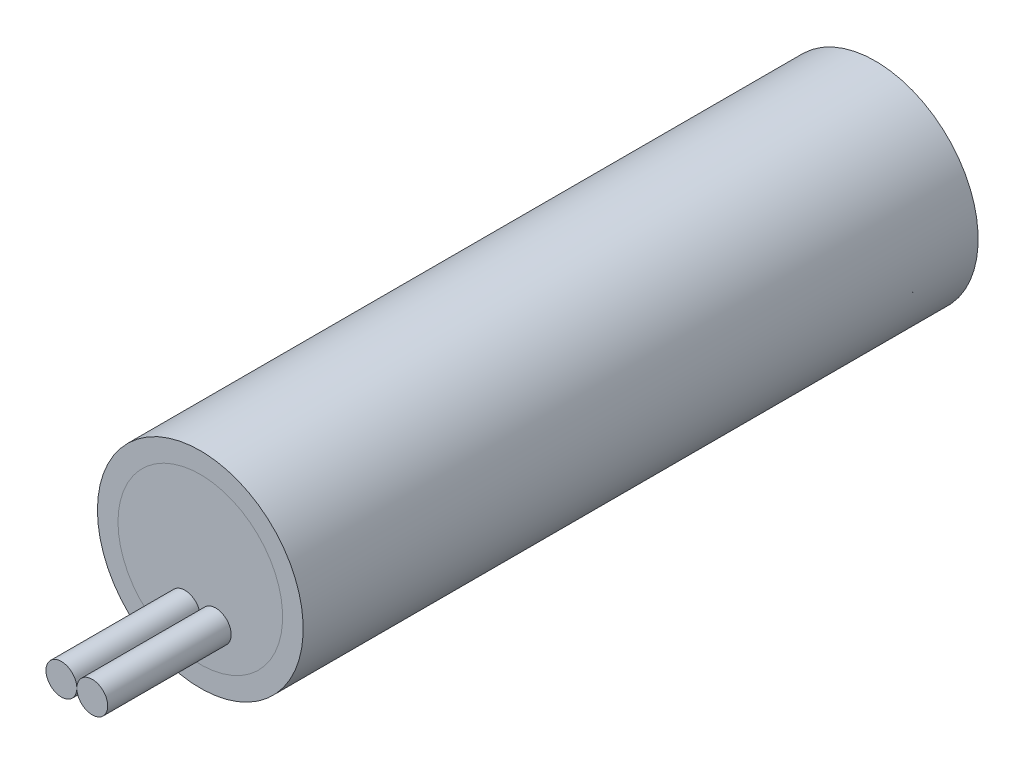
ISO-10303-21;
HEADER;
FILE_DESCRIPTION(('STEP AP214'),'2;1');
FILE_NAME('part.step','',(''),(''),'','','');
FILE_SCHEMA(('AUTOMOTIVE_DESIGN { 1 0 10303 214 1 1 1 1 }'));
ENDSEC;
DATA;
#1=APPLICATION_CONTEXT('core data for automotive mechanical design processes');
#2=APPLICATION_PROTOCOL_DEFINITION('international standard','automotive_design',2000,#1);
#3=PRODUCT_CONTEXT('',#1,'mechanical');
#4=PRODUCT('Part','Part','',(#3));
#5=PRODUCT_RELATED_PRODUCT_CATEGORY('part','',(#4));
#6=PRODUCT_DEFINITION_FORMATION('','',#4);
#7=PRODUCT_DEFINITION_CONTEXT('part definition',#1,'design');
#8=PRODUCT_DEFINITION('design','',#6,#7);
#9=PRODUCT_DEFINITION_SHAPE('','',#8);
#10=(LENGTH_UNIT() NAMED_UNIT(*) SI_UNIT(.MILLI.,.METRE.));
#11=(NAMED_UNIT(*) PLANE_ANGLE_UNIT() SI_UNIT($,.RADIAN.));
#12=(NAMED_UNIT(*) SI_UNIT($,.STERADIAN.) SOLID_ANGLE_UNIT());
#13=UNCERTAINTY_MEASURE_WITH_UNIT(LENGTH_MEASURE(1.E-05),#10,'distance_accuracy_value','');
#14=(GEOMETRIC_REPRESENTATION_CONTEXT(3) GLOBAL_UNCERTAINTY_ASSIGNED_CONTEXT((#13)) GLOBAL_UNIT_ASSIGNED_CONTEXT((#10,
#11,#12)) REPRESENTATION_CONTEXT('',''));
#15=CARTESIAN_POINT('',(0.,0.,0.));
#16=DIRECTION('',(0.,0.,1.));
#17=DIRECTION('',(1.,0.,0.));
#18=AXIS2_PLACEMENT_3D('',#15,#16,#17);
#19=CARTESIAN_POINT('',(0.,0.,0.));
#20=DIRECTION('',(0.,0.,1.));
#21=DIRECTION('',(1.,0.,0.));
#22=AXIS2_PLACEMENT_3D('',#19,#20,#21);
#23=PLANE('',#22);
#24=CARTESIAN_POINT('',(0.,0.,0.));
#25=DIRECTION('',(0.,0.,-1.));
#26=DIRECTION('',(1.,0.,0.));
#27=AXIS2_PLACEMENT_3D('',#24,#25,#26);
#28=CIRCLE('',#27,4.);
#29=CARTESIAN_POINT('',(-4.,0.,0.));
#30=VERTEX_POINT('',#29);
#31=EDGE_CURVE('P0_E48',#30,#30,#28,.T.);
#32=ORIENTED_EDGE('',*,*,#31,.F.);
#33=EDGE_LOOP('',(#32));
#34=FACE_BOUND('',#33,.T.);
#35=CARTESIAN_POINT('',(0.,0.,0.));
#36=DIRECTION('',(0.,0.,1.));
#37=DIRECTION('',(1.,0.,0.));
#38=AXIS2_PLACEMENT_3D('',#35,#36,#37);
#39=CIRCLE('',#38,5.);
#40=CARTESIAN_POINT('',(-5.,0.,0.));
#41=VERTEX_POINT('',#40);
#42=EDGE_CURVE('P0_E10',#41,#41,#39,.T.);
#43=ORIENTED_EDGE('',*,*,#42,.F.);
#44=EDGE_LOOP('',(#43));
#45=FACE_BOUND('',#44,.T.);
#46=ADVANCED_FACE('P0_F16',(#34,#45),#23,.F.);
#47=CARTESIAN_POINT('',(0.,0.,32.8));
#48=DIRECTION('',(0.,0.,1.));
#49=DIRECTION('',(1.,0.,0.));
#50=AXIS2_PLACEMENT_3D('',#47,#48,#49);
#51=PLANE('',#50);
#52=CARTESIAN_POINT('',(0.,0.,32.8));
#53=DIRECTION('',(0.,0.,-1.));
#54=DIRECTION('',(1.,0.,0.));
#55=AXIS2_PLACEMENT_3D('',#52,#53,#54);
#56=CIRCLE('',#55,4.);
#57=CARTESIAN_POINT('',(-4.,0.,32.8));
#58=VERTEX_POINT('',#57);
#59=EDGE_CURVE('P0_E55',#58,#58,#56,.T.);
#60=ORIENTED_EDGE('',*,*,#59,.T.);
#61=EDGE_LOOP('',(#60));
#62=FACE_BOUND('',#61,.T.);
#63=CARTESIAN_POINT('',(0.,0.,32.8));
#64=DIRECTION('',(0.,0.,1.));
#65=DIRECTION('',(1.,0.,0.));
#66=AXIS2_PLACEMENT_3D('',#63,#64,#65);
#67=CIRCLE('',#66,5.);
#68=CARTESIAN_POINT('',(-5.,0.,32.8));
#69=VERTEX_POINT('',#68);
#70=EDGE_CURVE('P0_E68',#69,#69,#67,.T.);
#71=ORIENTED_EDGE('',*,*,#70,.T.);
#72=EDGE_LOOP('',(#71));
#73=FACE_BOUND('',#72,.T.);
#74=ADVANCED_FACE('P0_F58',(#62,#73),#51,.T.);
#75=CARTESIAN_POINT('',(0.,0.,0.));
#76=DIRECTION('',(0.,0.,1.));
#77=DIRECTION('',(1.,0.,0.));
#78=AXIS2_PLACEMENT_3D('',#75,#76,#77);
#79=CYLINDRICAL_SURFACE('',#78,5.);
#80=ORIENTED_EDGE('',*,*,#70,.F.);
#81=DIRECTION('',(0.,0.,-1.));
#82=VECTOR('',#81,1.);
#83=CARTESIAN_POINT('',(-5.,0.,0.));
#84=LINE('',#83,#82);
#85=EDGE_CURVE('P0_E27',#69,#41,#84,.T.);
#86=ORIENTED_EDGE('',*,*,#85,.T.);
#87=ORIENTED_EDGE('',*,*,#42,.T.);
#88=ORIENTED_EDGE('',*,*,#85,.F.);
#89=EDGE_LOOP('',(#80,#86,#87,#88));
#90=FACE_BOUND('',#89,.T.);
#91=ADVANCED_FACE('P0_F18',(#90),#79,.T.);
#92=CARTESIAN_POINT('',(0.,0.,0.));
#93=DIRECTION('',(0.,0.,1.));
#94=DIRECTION('',(1.,0.,0.));
#95=AXIS2_PLACEMENT_3D('',#92,#93,#94);
#96=CYLINDRICAL_SURFACE('',#95,4.);
#97=ORIENTED_EDGE('',*,*,#59,.F.);
#98=DIRECTION('',(0.,0.,-1.));
#99=VECTOR('',#98,1.);
#100=CARTESIAN_POINT('',(-4.,0.,0.));
#101=LINE('',#100,#99);
#102=EDGE_CURVE('P0_E20',#58,#30,#101,.T.);
#103=ORIENTED_EDGE('',*,*,#102,.T.);
#104=ORIENTED_EDGE('',*,*,#31,.T.);
#105=ORIENTED_EDGE('',*,*,#102,.F.);
#106=EDGE_LOOP('',(#97,#103,#104,#105));
#107=FACE_BOUND('',#106,.T.);
#108=ADVANCED_FACE('P0_F54',(#107),#96,.F.);
#109=CLOSED_SHELL('',(#46,#74,#91,#108));
#110=MANIFOLD_SOLID_BREP('P0_B1',#109);
#111=CARTESIAN_POINT('',(0.,0.,32.8));
#112=DIRECTION('',(0.,0.,1.));
#113=DIRECTION('',(1.,0.,0.));
#114=AXIS2_PLACEMENT_3D('',#111,#112,#113);
#115=PLANE('',#114);
#116=CARTESIAN_POINT('',(0.,0.,32.8));
#117=DIRECTION('',(0.,0.,1.));
#118=DIRECTION('',(1.,0.,0.));
#119=AXIS2_PLACEMENT_3D('',#116,#117,#118);
#120=CIRCLE('',#119,4.);
#121=CARTESIAN_POINT('',(-4.,0.,32.8));
#122=VERTEX_POINT('',#121);
#123=EDGE_CURVE('P1_E147',#122,#122,#120,.T.);
#124=ORIENTED_EDGE('',*,*,#123,.T.);
#125=EDGE_LOOP('',(#124));
#126=FACE_BOUND('',#125,.T.);
#127=ADVANCED_FACE('P1_F17',(#126),#115,.T.);
#128=CARTESIAN_POINT('',(0.,0.,0.));
#129=DIRECTION('',(0.,0.,1.));
#130=DIRECTION('',(1.,0.,0.));
#131=AXIS2_PLACEMENT_3D('',#128,#129,#130);
#132=PLANE('',#131);
#133=CARTESIAN_POINT('',(0.,0.,0.));
#134=DIRECTION('',(0.,0.,1.));
#135=DIRECTION('',(0.,1.,0.));
#136=AXIS2_PLACEMENT_3D('',#133,#134,#135);
#137=CIRCLE('',#136,3.9);
#138=CARTESIAN_POINT('',(0.,3.9,0.));
#139=VERTEX_POINT('',#138);
#140=CARTESIAN_POINT('',(0.,-3.9,0.));
#141=VERTEX_POINT('',#140);
#142=EDGE_CURVE('P1_E28',#139,#141,#137,.T.);
#143=ORIENTED_EDGE('',*,*,#142,.T.);
#144=CARTESIAN_POINT('',(0.,0.,0.));
#145=DIRECTION('',(0.,0.,1.));
#146=DIRECTION('',(0.,1.,0.));
#147=AXIS2_PLACEMENT_3D('',#144,#145,#146);
#148=CIRCLE('',#147,3.9);
#149=EDGE_CURVE('P1_E11',#141,#139,#148,.T.);
#150=ORIENTED_EDGE('',*,*,#149,.T.);
#151=EDGE_LOOP('',(#143,#150));
#152=FACE_BOUND('',#151,.T.);
#153=CARTESIAN_POINT('',(0.,0.,0.));
#154=DIRECTION('',(0.,0.,1.));
#155=DIRECTION('',(1.,0.,0.));
#156=AXIS2_PLACEMENT_3D('',#153,#154,#155);
#157=CIRCLE('',#156,4.);
#158=CARTESIAN_POINT('',(4.,0.,0.));
#159=VERTEX_POINT('',#158);
#160=CARTESIAN_POINT('',(-4.,0.,0.));
#161=VERTEX_POINT('',#160);
#162=EDGE_CURVE('P1_E132',#159,#161,#157,.T.);
#163=ORIENTED_EDGE('',*,*,#162,.F.);
#164=CARTESIAN_POINT('',(0.,0.,0.));
#165=DIRECTION('',(0.,0.,1.));
#166=DIRECTION('',(1.,0.,0.));
#167=AXIS2_PLACEMENT_3D('',#164,#165,#166);
#168=CIRCLE('',#167,4.);
#169=EDGE_CURVE('P1_E139',#161,#159,#168,.T.);
#170=ORIENTED_EDGE('',*,*,#169,.F.);
#171=EDGE_LOOP('',(#163,#170));
#172=FACE_BOUND('',#171,.T.);
#173=ADVANCED_FACE('P1_F144',(#152,#172),#132,.F.);
#174=CARTESIAN_POINT('',(0.,0.,0.25));
#175=DIRECTION('',(0.,0.,-1.));
#176=DIRECTION('',(0.,1.,0.));
#177=AXIS2_PLACEMENT_3D('',#174,#175,#176);
#178=CONICAL_SURFACE('',#177,3.65,0.785398163397449);
#179=CARTESIAN_POINT('',(0.,0.,0.5));
#180=DIRECTION('',(0.,0.,-1.));
#181=DIRECTION('',(1.,0.,0.));
#182=AXIS2_PLACEMENT_3D('',#179,#180,#181);
#183=CIRCLE('',#182,3.4);
#184=CARTESIAN_POINT('',(-3.36303434416005,0.5,0.5));
#185=VERTEX_POINT('',#184);
#186=CARTESIAN_POINT('',(3.36303434416005,0.5,0.5));
#187=VERTEX_POINT('',#186);
#188=EDGE_CURVE('P1_E169',#185,#187,#183,.T.);
#189=ORIENTED_EDGE('',*,*,#188,.F.);
#190=CARTESIAN_POINT('',(0.,0.,0.5));
#191=DIRECTION('',(0.,0.,-1.));
#192=DIRECTION('',(1.,0.,0.));
#193=AXIS2_PLACEMENT_3D('',#190,#191,#192);
#194=CIRCLE('',#193,3.4);
#195=CARTESIAN_POINT('',(-3.36303434416005,-0.5,0.5));
#196=VERTEX_POINT('',#195);
#197=EDGE_CURVE('P1_E209',#196,#185,#194,.T.);
#198=ORIENTED_EDGE('',*,*,#197,.F.);
#199=CARTESIAN_POINT('',(0.,0.,0.5));
#200=DIRECTION('',(0.,0.,-1.));
#201=DIRECTION('',(1.,0.,0.));
#202=AXIS2_PLACEMENT_3D('',#199,#200,#201);
#203=CIRCLE('',#202,3.4);
#204=CARTESIAN_POINT('',(0.,-3.4,0.5));
#205=VERTEX_POINT('',#204);
#206=EDGE_CURVE('P1_E182',#205,#196,#203,.T.);
#207=ORIENTED_EDGE('',*,*,#206,.F.);
#208=DIRECTION('',(0.,-0.707106781186548,-0.707106781186547));
#209=VECTOR('',#208,1.);
#210=CARTESIAN_POINT('',(0.,-3.65,0.25));
#211=LINE('',#210,#209);
#212=EDGE_CURVE('P1_E278',#205,#141,#211,.T.);
#213=ORIENTED_EDGE('',*,*,#212,.T.);
#214=ORIENTED_EDGE('',*,*,#142,.F.);
#215=ORIENTED_EDGE('',*,*,#149,.F.);
#216=ORIENTED_EDGE('',*,*,#212,.F.);
#217=CARTESIAN_POINT('',(0.,0.,0.5));
#218=DIRECTION('',(0.,0.,-1.));
#219=DIRECTION('',(1.,0.,0.));
#220=AXIS2_PLACEMENT_3D('',#217,#218,#219);
#221=CIRCLE('',#220,3.4);
#222=CARTESIAN_POINT('',(3.36303434416005,-0.5,0.5));
#223=VERTEX_POINT('',#222);
#224=EDGE_CURVE('P1_E173',#223,#205,#221,.T.);
#225=ORIENTED_EDGE('',*,*,#224,.F.);
#226=CARTESIAN_POINT('',(0.,0.,0.5));
#227=DIRECTION('',(0.,0.,-1.));
#228=DIRECTION('',(1.,0.,0.));
#229=AXIS2_PLACEMENT_3D('',#226,#227,#228);
#230=CIRCLE('',#229,3.4);
#231=EDGE_CURVE('P1_E158',#187,#223,#230,.T.);
#232=ORIENTED_EDGE('',*,*,#231,.F.);
#233=EDGE_LOOP('',(#189,#198,#207,#213,#214,#215,#216,#225,#232));
#234=FACE_BOUND('',#233,.T.);
#235=ADVANCED_FACE('P1_F368',(#234),#178,.F.);
#236=CARTESIAN_POINT('',(0.,0.,1.2));
#237=DIRECTION('',(0.,0.,1.));
#238=DIRECTION('',(1.,0.,0.));
#239=AXIS2_PLACEMENT_3D('',#236,#237,#238);
#240=PLANE('',#239);
#241=CARTESIAN_POINT('',(0.,0.,1.2));
#242=DIRECTION('',(0.,0.,1.));
#243=DIRECTION('',(1.,0.,0.));
#244=AXIS2_PLACEMENT_3D('',#241,#242,#243);
#245=CIRCLE('',#244,1.5);
#246=CARTESIAN_POINT('',(-1.5,0.,1.2));
#247=VERTEX_POINT('',#246);
#248=EDGE_CURVE('P1_E200',#247,#247,#245,.T.);
#249=ORIENTED_EDGE('',*,*,#248,.F.);
#250=EDGE_LOOP('',(#249));
#251=FACE_BOUND('',#250,.T.);
#252=ADVANCED_FACE('P1_F523',(#251),#240,.F.);
#253=CARTESIAN_POINT('',(0.,0.,0.25));
#254=DIRECTION('',(0.,0.,1.));
#255=DIRECTION('',(0.,-1.,0.));
#256=AXIS2_PLACEMENT_3D('',#253,#254,#255);
#257=CONICAL_SURFACE('',#256,3.15,0.785398163397447);
#258=CARTESIAN_POINT('',(-3.36303434416005,-0.5,0.5));
#259=CARTESIAN_POINT('',(-3.08970512077148,-0.500000000000002,0.229642480729904));
#260=CARTESIAN_POINT('',(-2.85657137141714,-0.5,0.));
#261=(BOUNDED_CURVE() B_SPLINE_CURVE(2,(#258,#259,#260),.UNSPECIFIED.,.F.,
.F.) B_SPLINE_CURVE_WITH_KNOTS((3,3),(0.,0.0711691561271703),
.UNSPECIFIED.) CURVE() GEOMETRIC_REPRESENTATION_ITEM() RATIONAL_B_SPLINE_CURVE((1.,
1.0032470995596,1.)) REPRESENTATION_ITEM(''));
#262=CARTESIAN_POINT('',(-2.85657137141714,-0.5,0.));
#263=VERTEX_POINT('',#262);
#264=EDGE_CURVE('P1_E287',#196,#263,#261,.T.);
#265=ORIENTED_EDGE('',*,*,#264,.T.);
#266=CARTESIAN_POINT('',(0.,0.,0.));
#267=DIRECTION('',(0.,0.,-1.));
#268=DIRECTION('',(0.,1.,0.));
#269=AXIS2_PLACEMENT_3D('',#266,#267,#268);
#270=CIRCLE('',#269,2.9);
#271=CARTESIAN_POINT('',(2.85657137141714,-0.5,0.));
#272=VERTEX_POINT('',#271);
#273=EDGE_CURVE('P1_E162',#272,#263,#270,.T.);
#274=ORIENTED_EDGE('',*,*,#273,.F.);
#275=CARTESIAN_POINT('',(2.85657137141714,-0.5,0.));
#276=CARTESIAN_POINT('',(3.08970512077148,-0.500000000000002,0.229642480729904));
#277=CARTESIAN_POINT('',(3.36303434416005,-0.5,0.5));
#278=(BOUNDED_CURVE() B_SPLINE_CURVE(2,(#275,#276,#277),.UNSPECIFIED.,.F.,
.F.) B_SPLINE_CURVE_WITH_KNOTS((3,3),(0.,0.0711691561271703),
.UNSPECIFIED.) CURVE() GEOMETRIC_REPRESENTATION_ITEM() RATIONAL_B_SPLINE_CURVE((1.,
1.0032470995596,1.)) REPRESENTATION_ITEM(''));
#279=EDGE_CURVE('P1_E213',#272,#223,#278,.T.);
#280=ORIENTED_EDGE('',*,*,#279,.T.);
#281=ORIENTED_EDGE('',*,*,#224,.T.);
#282=ORIENTED_EDGE('',*,*,#206,.T.);
#283=EDGE_LOOP('',(#265,#274,#280,#281,#282));
#284=FACE_BOUND('',#283,.T.);
#285=ADVANCED_FACE('P1_F373',(#284),#257,.T.);
#286=CARTESIAN_POINT('',(0.,0.,0.25));
#287=DIRECTION('',(0.,0.,1.));
#288=DIRECTION('',(0.,1.,0.));
#289=AXIS2_PLACEMENT_3D('',#286,#287,#288);
#290=CONICAL_SURFACE('',#289,3.15,0.785398163397447);
#291=CARTESIAN_POINT('',(-2.85657137141714,0.5,0.));
#292=CARTESIAN_POINT('',(-3.08970512078075,0.499999999999998,0.229642480739052));
#293=CARTESIAN_POINT('',(-3.36303434416005,0.5,0.5));
#294=(BOUNDED_CURVE() B_SPLINE_CURVE(2,(#291,#292,#293),.UNSPECIFIED.,.F.,
.F.) B_SPLINE_CURVE_WITH_KNOTS((3,3),(0.,0.0711691561271703),
.UNSPECIFIED.) CURVE() GEOMETRIC_REPRESENTATION_ITEM() RATIONAL_B_SPLINE_CURVE((1.,
1.00324709955416,1.)) REPRESENTATION_ITEM(''));
#295=CARTESIAN_POINT('',(-2.85657137141714,0.5,0.));
#296=VERTEX_POINT('',#295);
#297=EDGE_CURVE('P1_E272',#296,#185,#294,.T.);
#298=ORIENTED_EDGE('',*,*,#297,.T.);
#299=ORIENTED_EDGE('',*,*,#188,.T.);
#300=CARTESIAN_POINT('',(3.36303434416005,0.5,0.5));
#301=CARTESIAN_POINT('',(3.08970512078075,0.499999999999998,0.229642480739052));
#302=CARTESIAN_POINT('',(2.85657137141714,0.5,0.));
#303=(BOUNDED_CURVE() B_SPLINE_CURVE(2,(#300,#301,#302),.UNSPECIFIED.,.F.,
.F.) B_SPLINE_CURVE_WITH_KNOTS((3,3),(0.,0.0711691561271703),
.UNSPECIFIED.) CURVE() GEOMETRIC_REPRESENTATION_ITEM() RATIONAL_B_SPLINE_CURVE((1.,
1.00324709955416,1.)) REPRESENTATION_ITEM(''));
#304=CARTESIAN_POINT('',(2.85657137141714,0.5,0.));
#305=VERTEX_POINT('',#304);
#306=EDGE_CURVE('P1_E154',#187,#305,#303,.T.);
#307=ORIENTED_EDGE('',*,*,#306,.T.);
#308=CARTESIAN_POINT('',(0.,0.,0.));
#309=DIRECTION('',(0.,0.,-1.));
#310=DIRECTION('',(0.,1.,0.));
#311=AXIS2_PLACEMENT_3D('',#308,#309,#310);
#312=CIRCLE('',#311,2.9);
#313=EDGE_CURVE('P1_E142',#296,#305,#312,.T.);
#314=ORIENTED_EDGE('',*,*,#313,.F.);
#315=EDGE_LOOP('',(#298,#299,#307,#314));
#316=FACE_BOUND('',#315,.T.);
#317=ADVANCED_FACE('P1_F511',(#316),#290,.T.);
#318=CARTESIAN_POINT('',(0.,0.,0.));
#319=DIRECTION('',(0.,0.,1.));
#320=DIRECTION('',(1.,0.,0.));
#321=AXIS2_PLACEMENT_3D('',#318,#319,#320);
#322=PLANE('',#321);
#323=CARTESIAN_POINT('',(0.,0.,0.));
#324=DIRECTION('',(0.,0.,-1.));
#325=DIRECTION('',(1.,0.,0.));
#326=AXIS2_PLACEMENT_3D('',#323,#324,#325);
#327=CIRCLE('',#326,1.7);
#328=CARTESIAN_POINT('',(1.62480768092719,-0.5,0.));
#329=VERTEX_POINT('',#328);
#330=CARTESIAN_POINT('',(-1.62480768092719,-0.5,0.));
#331=VERTEX_POINT('',#330);
#332=EDGE_CURVE('P1_E225',#329,#331,#327,.T.);
#333=ORIENTED_EDGE('',*,*,#332,.F.);
#334=DIRECTION('',(1.,0.,0.));
#335=VECTOR('',#334,1.);
#336=CARTESIAN_POINT('',(-1.68151717208002,-0.5,0.));
#337=LINE('',#336,#335);
#338=EDGE_CURVE('P1_E267',#329,#272,#337,.T.);
#339=ORIENTED_EDGE('',*,*,#338,.T.);
#340=ORIENTED_EDGE('',*,*,#273,.T.);
#341=DIRECTION('',(1.,0.,0.));
#342=VECTOR('',#341,1.);
#343=CARTESIAN_POINT('',(-1.68151717208002,-0.5,0.));
#344=LINE('',#343,#342);
#345=EDGE_CURVE('P1_E294',#263,#331,#344,.T.);
#346=ORIENTED_EDGE('',*,*,#345,.T.);
#347=EDGE_LOOP('',(#333,#339,#340,#346));
#348=FACE_BOUND('',#347,.T.);
#349=ADVANCED_FACE('P1_F340',(#348),#322,.F.);
#350=CARTESIAN_POINT('',(0.,0.,0.));
#351=DIRECTION('',(0.,0.,1.));
#352=DIRECTION('',(1.,0.,0.));
#353=AXIS2_PLACEMENT_3D('',#350,#351,#352);
#354=PLANE('',#353);
#355=CARTESIAN_POINT('',(0.,0.,0.));
#356=DIRECTION('',(0.,0.,-1.));
#357=DIRECTION('',(1.,0.,0.));
#358=AXIS2_PLACEMENT_3D('',#355,#356,#357);
#359=CIRCLE('',#358,1.7);
#360=CARTESIAN_POINT('',(-1.62480768092719,0.5,0.));
#361=VERTEX_POINT('',#360);
#362=CARTESIAN_POINT('',(1.62480768092719,0.5,0.));
#363=VERTEX_POINT('',#362);
#364=EDGE_CURVE('P1_E232',#361,#363,#359,.T.);
#365=ORIENTED_EDGE('',*,*,#364,.F.);
#366=DIRECTION('',(-1.,0.,0.));
#367=VECTOR('',#366,1.);
#368=CARTESIAN_POINT('',(1.68151717208002,0.5,0.));
#369=LINE('',#368,#367);
#370=EDGE_CURVE('P1_E218',#361,#296,#369,.T.);
#371=ORIENTED_EDGE('',*,*,#370,.T.);
#372=ORIENTED_EDGE('',*,*,#313,.T.);
#373=DIRECTION('',(-1.,0.,0.));
#374=VECTOR('',#373,1.);
#375=CARTESIAN_POINT('',(1.68151717208002,0.5,0.));
#376=LINE('',#375,#374);
#377=EDGE_CURVE('P1_E271',#305,#363,#376,.T.);
#378=ORIENTED_EDGE('',*,*,#377,.T.);
#379=EDGE_LOOP('',(#365,#371,#372,#378));
#380=FACE_BOUND('',#379,.T.);
#381=ADVANCED_FACE('P1_F510',(#380),#354,.F.);
#382=CARTESIAN_POINT('',(0.,0.,0.));
#383=DIRECTION('',(0.,0.,1.));
#384=DIRECTION('',(1.,0.,0.));
#385=AXIS2_PLACEMENT_3D('',#382,#383,#384);
#386=CYLINDRICAL_SURFACE('',#385,4.);
#387=ORIENTED_EDGE('',*,*,#123,.F.);
#388=DIRECTION('',(0.,0.,-1.));
#389=VECTOR('',#388,1.);
#390=CARTESIAN_POINT('',(-4.,0.,0.));
#391=LINE('',#390,#389);
#392=EDGE_CURVE('P1_E137',#122,#161,#391,.T.);
#393=ORIENTED_EDGE('',*,*,#392,.T.);
#394=ORIENTED_EDGE('',*,*,#169,.T.);
#395=ORIENTED_EDGE('',*,*,#162,.T.);
#396=ORIENTED_EDGE('',*,*,#392,.F.);
#397=EDGE_LOOP('',(#387,#393,#394,#395,#396));
#398=FACE_BOUND('',#397,.T.);
#399=ADVANCED_FACE('P1_F135',(#398),#386,.T.);
#400=CARTESIAN_POINT('',(3.36303434416005,0.5,0.));
#401=DIRECTION('',(0.,1.,0.));
#402=DIRECTION('',(1.,0.,0.));
#403=AXIS2_PLACEMENT_3D('',#400,#401,#402);
#404=PLANE('',#403);
#405=CARTESIAN_POINT('',(1.62480768092719,0.5,0.));
#406=CARTESIAN_POINT('',(1.51292955544534,0.499999999999998,0.106929669182736));
#407=CARTESIAN_POINT('',(1.4142135623731,0.499999999999998,0.2));
#408=(BOUNDED_CURVE() B_SPLINE_CURVE(2,(#405,#406,#407),.UNSPECIFIED.,.F.,
.F.) B_SPLINE_CURVE_WITH_KNOTS((3,3),(0.,0.0258582271106274),
.UNSPECIFIED.) CURVE() GEOMETRIC_REPRESENTATION_ITEM() RATIONAL_B_SPLINE_CURVE((1.,
1.00614820018873,1.00794973754708)) REPRESENTATION_ITEM(''));
#409=CARTESIAN_POINT('',(1.4142135623731,0.5,0.2));
#410=VERTEX_POINT('',#409);
#411=EDGE_CURVE('P1_E178',#363,#410,#408,.T.);
#412=ORIENTED_EDGE('',*,*,#411,.F.);
#413=ORIENTED_EDGE('',*,*,#377,.F.);
#414=ORIENTED_EDGE('',*,*,#306,.F.);
#415=DIRECTION('',(-1.,0.,0.));
#416=VECTOR('',#415,1.);
#417=CARTESIAN_POINT('',(4.,0.5,0.5));
#418=LINE('',#417,#416);
#419=CARTESIAN_POINT('',(1.4142135623731,0.5,0.5));
#420=VERTEX_POINT('',#419);
#421=EDGE_CURVE('P1_E295',#187,#420,#418,.T.);
#422=ORIENTED_EDGE('',*,*,#421,.T.);
#423=DIRECTION('',(0.,0.,1.));
#424=VECTOR('',#423,1.);
#425=CARTESIAN_POINT('',(1.4142135623731,0.5,0.));
#426=LINE('',#425,#424);
#427=EDGE_CURVE('P1_E168',#410,#420,#426,.T.);
#428=ORIENTED_EDGE('',*,*,#427,.F.);
#429=EDGE_LOOP('',(#412,#413,#414,#422,#428));
#430=FACE_BOUND('',#429,.T.);
#431=ADVANCED_FACE('P1_F545',(#430),#404,.F.);
#432=CARTESIAN_POINT('',(-3.36303434416005,-0.5,0.));
#433=DIRECTION('',(0.,-1.,0.));
#434=DIRECTION('',(0.,0.,-1.));
#435=AXIS2_PLACEMENT_3D('',#432,#433,#434);
#436=PLANE('',#435);
#437=CARTESIAN_POINT('',(1.41421356237309,-0.500000000000002,0.2));
#438=CARTESIAN_POINT('',(1.51292955544532,-0.500000000000002,0.106929669182751));
#439=CARTESIAN_POINT('',(1.62480768092719,-0.5,0.));
#440=(BOUNDED_CURVE() B_SPLINE_CURVE(2,(#437,#438,#439),.UNSPECIFIED.,.F.,
.F.) B_SPLINE_CURVE_WITH_KNOTS((3,3),(0.0472928605194052,0.0731510876300252),
.UNSPECIFIED.) CURVE() GEOMETRIC_REPRESENTATION_ITEM() RATIONAL_B_SPLINE_CURVE((1.00794973754713,
1.00614820018877,1.)) REPRESENTATION_ITEM(''));
#441=CARTESIAN_POINT('',(1.41421356237309,-0.5,0.2));
#442=VERTEX_POINT('',#441);
#443=EDGE_CURVE('P1_E219',#442,#329,#440,.T.);
#444=ORIENTED_EDGE('',*,*,#443,.F.);
#445=DIRECTION('',(0.,0.,-1.));
#446=VECTOR('',#445,1.);
#447=CARTESIAN_POINT('',(1.41421356237309,-0.5,0.));
#448=LINE('',#447,#446);
#449=CARTESIAN_POINT('',(1.41421356237309,-0.5,0.5));
#450=VERTEX_POINT('',#449);
#451=EDGE_CURVE('P1_E167',#450,#442,#448,.T.);
#452=ORIENTED_EDGE('',*,*,#451,.F.);
#453=DIRECTION('',(1.,0.,0.));
#454=VECTOR('',#453,1.);
#455=CARTESIAN_POINT('',(-4.,-0.5,0.5));
#456=LINE('',#455,#454);
#457=EDGE_CURVE('P1_E214',#450,#223,#456,.T.);
#458=ORIENTED_EDGE('',*,*,#457,.T.);
#459=ORIENTED_EDGE('',*,*,#279,.F.);
#460=ORIENTED_EDGE('',*,*,#338,.F.);
#461=EDGE_LOOP('',(#444,#452,#458,#459,#460));
#462=FACE_BOUND('',#461,.T.);
#463=ADVANCED_FACE('P1_F349',(#462),#436,.F.);
#464=CARTESIAN_POINT('',(0.,0.,0.5));
#465=DIRECTION('',(0.,0.,1.));
#466=DIRECTION('',(1.,0.,0.));
#467=AXIS2_PLACEMENT_3D('',#464,#465,#466);
#468=PLANE('',#467);
#469=CARTESIAN_POINT('',(0.,0.,0.5));
#470=DIRECTION('',(0.,0.,-1.));
#471=DIRECTION('',(1.,0.,0.));
#472=AXIS2_PLACEMENT_3D('',#469,#470,#471);
#473=CIRCLE('',#472,1.5);
#474=CARTESIAN_POINT('',(-1.41421356237309,-0.5,0.5));
#475=VERTEX_POINT('',#474);
#476=CARTESIAN_POINT('',(-1.5,0.,0.5));
#477=VERTEX_POINT('',#476);
#478=EDGE_CURVE('P1_E188',#475,#477,#473,.T.);
#479=ORIENTED_EDGE('',*,*,#478,.F.);
#480=DIRECTION('',(1.,0.,0.));
#481=VECTOR('',#480,1.);
#482=CARTESIAN_POINT('',(-4.,-0.5,0.5));
#483=LINE('',#482,#481);
#484=EDGE_CURVE('P1_E293',#196,#475,#483,.T.);
#485=ORIENTED_EDGE('',*,*,#484,.F.);
#486=ORIENTED_EDGE('',*,*,#197,.T.);
#487=DIRECTION('',(-1.,0.,0.));
#488=VECTOR('',#487,1.);
#489=CARTESIAN_POINT('',(4.,0.5,0.5));
#490=LINE('',#489,#488);
#491=CARTESIAN_POINT('',(-1.4142135623731,0.5,0.5));
#492=VERTEX_POINT('',#491);
#493=EDGE_CURVE('P1_E21',#492,#185,#490,.T.);
#494=ORIENTED_EDGE('',*,*,#493,.F.);
#495=CARTESIAN_POINT('',(0.,0.,0.5));
#496=DIRECTION('',(0.,0.,-1.));
#497=DIRECTION('',(1.,0.,0.));
#498=AXIS2_PLACEMENT_3D('',#495,#496,#497);
#499=CIRCLE('',#498,1.5);
#500=EDGE_CURVE('P1_E226',#477,#492,#499,.T.);
#501=ORIENTED_EDGE('',*,*,#500,.F.);
#502=EDGE_LOOP('',(#479,#485,#486,#494,#501));
#503=FACE_BOUND('',#502,.T.);
#504=ADVANCED_FACE('P1_F19',(#503),#468,.F.);
#505=CARTESIAN_POINT('',(0.,0.,0.5));
#506=DIRECTION('',(0.,0.,1.));
#507=DIRECTION('',(1.,0.,0.));
#508=AXIS2_PLACEMENT_3D('',#505,#506,#507);
#509=PLANE('',#508);
#510=CARTESIAN_POINT('',(0.,0.,0.5));
#511=DIRECTION('',(0.,0.,-1.));
#512=DIRECTION('',(1.,0.,0.));
#513=AXIS2_PLACEMENT_3D('',#510,#511,#512);
#514=CIRCLE('',#513,1.5);
#515=EDGE_CURVE('P1_E163',#420,#450,#514,.T.);
#516=ORIENTED_EDGE('',*,*,#515,.F.);
#517=ORIENTED_EDGE('',*,*,#421,.F.);
#518=ORIENTED_EDGE('',*,*,#231,.T.);
#519=ORIENTED_EDGE('',*,*,#457,.F.);
#520=EDGE_LOOP('',(#516,#517,#518,#519));
#521=FACE_BOUND('',#520,.T.);
#522=ADVANCED_FACE('P1_F376',(#521),#509,.F.);
#523=CARTESIAN_POINT('',(-3.36303434416005,-0.5,0.));
#524=DIRECTION('',(0.,-1.,0.));
#525=DIRECTION('',(0.,0.,-1.));
#526=AXIS2_PLACEMENT_3D('',#523,#524,#525);
#527=PLANE('',#526);
#528=CARTESIAN_POINT('',(-1.62480768092719,-0.5,0.));
#529=CARTESIAN_POINT('',(-1.51292955544532,-0.500000000000002,0.106929669182751));
#530=CARTESIAN_POINT('',(-1.41421356237309,-0.500000000000002,0.2));
#531=(BOUNDED_CURVE() B_SPLINE_CURVE(2,(#528,#529,#530),.UNSPECIFIED.,.F.,
.F.) B_SPLINE_CURVE_WITH_KNOTS((3,3),(0.,0.02585822711062),
.UNSPECIFIED.) CURVE() GEOMETRIC_REPRESENTATION_ITEM() RATIONAL_B_SPLINE_CURVE((1.,
1.00614820018877,1.00794973754713)) REPRESENTATION_ITEM(''));
#532=CARTESIAN_POINT('',(-1.41421356237309,-0.5,0.2));
#533=VERTEX_POINT('',#532);
#534=EDGE_CURVE('P1_E261',#331,#533,#531,.T.);
#535=ORIENTED_EDGE('',*,*,#534,.F.);
#536=ORIENTED_EDGE('',*,*,#345,.F.);
#537=ORIENTED_EDGE('',*,*,#264,.F.);
#538=ORIENTED_EDGE('',*,*,#484,.T.);
#539=DIRECTION('',(0.,0.,1.));
#540=VECTOR('',#539,1.);
#541=CARTESIAN_POINT('',(-1.41421356237309,-0.5,0.));
#542=LINE('',#541,#540);
#543=EDGE_CURVE('P1_E187',#533,#475,#542,.T.);
#544=ORIENTED_EDGE('',*,*,#543,.F.);
#545=EDGE_LOOP('',(#535,#536,#537,#538,#544));
#546=FACE_BOUND('',#545,.T.);
#547=ADVANCED_FACE('P1_F343',(#546),#527,.F.);
#548=CARTESIAN_POINT('',(0.,0.,0.1));
#549=DIRECTION('',(0.,0.,-1.));
#550=DIRECTION('',(1.,0.,0.));
#551=AXIS2_PLACEMENT_3D('',#548,#549,#550);
#552=CONICAL_SURFACE('',#551,1.6,0.785398163397449);
#553=ORIENTED_EDGE('',*,*,#443,.T.);
#554=ORIENTED_EDGE('',*,*,#332,.T.);
#555=ORIENTED_EDGE('',*,*,#534,.T.);
#556=CARTESIAN_POINT('',(0.,0.,0.2));
#557=DIRECTION('',(0.,0.,1.));
#558=DIRECTION('',(1.,0.,0.));
#559=AXIS2_PLACEMENT_3D('',#556,#557,#558);
#560=CIRCLE('',#559,1.5);
#561=EDGE_CURVE('P1_E184',#533,#442,#560,.T.);
#562=ORIENTED_EDGE('',*,*,#561,.T.);
#563=EDGE_LOOP('',(#553,#554,#555,#562));
#564=FACE_BOUND('',#563,.T.);
#565=ADVANCED_FACE('P1_F345',(#564),#552,.F.);
#566=CARTESIAN_POINT('',(0.,0.,0.));
#567=DIRECTION('',(0.,0.,1.));
#568=DIRECTION('',(1.,0.,0.));
#569=AXIS2_PLACEMENT_3D('',#566,#567,#568);
#570=CYLINDRICAL_SURFACE('',#569,1.5);
#571=CARTESIAN_POINT('',(0.,0.,0.2));
#572=DIRECTION('',(0.,0.,1.));
#573=DIRECTION('',(1.,0.,0.));
#574=AXIS2_PLACEMENT_3D('',#571,#572,#573);
#575=CIRCLE('',#574,1.5);
#576=CARTESIAN_POINT('',(-1.4142135623731,0.5,0.2));
#577=VERTEX_POINT('',#576);
#578=EDGE_CURVE('P1_E174',#410,#577,#575,.T.);
#579=ORIENTED_EDGE('',*,*,#578,.F.);
#580=ORIENTED_EDGE('',*,*,#427,.T.);
#581=ORIENTED_EDGE('',*,*,#515,.T.);
#582=ORIENTED_EDGE('',*,*,#451,.T.);
#583=ORIENTED_EDGE('',*,*,#561,.F.);
#584=ORIENTED_EDGE('',*,*,#543,.T.);
#585=ORIENTED_EDGE('',*,*,#478,.T.);
#586=DIRECTION('',(0.,0.,1.));
#587=VECTOR('',#586,1.);
#588=CARTESIAN_POINT('',(-1.5,0.,0.));
#589=LINE('',#588,#587);
#590=EDGE_CURVE('P1_E191',#477,#247,#589,.T.);
#591=ORIENTED_EDGE('',*,*,#590,.T.);
#592=ORIENTED_EDGE('',*,*,#248,.T.);
#593=ORIENTED_EDGE('',*,*,#590,.F.);
#594=ORIENTED_EDGE('',*,*,#500,.T.);
#595=DIRECTION('',(0.,0.,-1.));
#596=VECTOR('',#595,1.);
#597=CARTESIAN_POINT('',(-1.4142135623731,0.5,0.));
#598=LINE('',#597,#596);
#599=EDGE_CURVE('P1_E177',#492,#577,#598,.T.);
#600=ORIENTED_EDGE('',*,*,#599,.T.);
#601=EDGE_LOOP('',(#579,#580,#581,#582,#583,#584,#585,#591,#592,#593,#594,#600));
#602=FACE_BOUND('',#601,.T.);
#603=ADVANCED_FACE('P1_F575',(#602),#570,.F.);
#604=CARTESIAN_POINT('',(3.36303434416005,0.5,0.));
#605=DIRECTION('',(0.,1.,0.));
#606=DIRECTION('',(1.,0.,0.));
#607=AXIS2_PLACEMENT_3D('',#604,#605,#606);
#608=PLANE('',#607);
#609=CARTESIAN_POINT('',(-1.4142135623731,0.499999999999998,0.2));
#610=CARTESIAN_POINT('',(-1.51292955544534,0.499999999999998,0.106929669182736));
#611=CARTESIAN_POINT('',(-1.62480768092719,0.5,0.));
#612=(BOUNDED_CURVE() B_SPLINE_CURVE(2,(#609,#610,#611),.UNSPECIFIED.,.F.,
.F.) B_SPLINE_CURVE_WITH_KNOTS((3,3),(0.0472928605193978,0.0731510876300252),
.UNSPECIFIED.) CURVE() GEOMETRIC_REPRESENTATION_ITEM() RATIONAL_B_SPLINE_CURVE((1.00794973754708,
1.00614820018873,1.)) REPRESENTATION_ITEM(''));
#613=EDGE_CURVE('P1_E235',#577,#361,#612,.T.);
#614=ORIENTED_EDGE('',*,*,#613,.F.);
#615=ORIENTED_EDGE('',*,*,#599,.F.);
#616=ORIENTED_EDGE('',*,*,#493,.T.);
#617=ORIENTED_EDGE('',*,*,#297,.F.);
#618=ORIENTED_EDGE('',*,*,#370,.F.);
#619=EDGE_LOOP('',(#614,#615,#616,#617,#618));
#620=FACE_BOUND('',#619,.T.);
#621=ADVANCED_FACE('P1_F568',(#620),#608,.F.);
#622=CARTESIAN_POINT('',(0.,0.,0.1));
#623=DIRECTION('',(0.,0.,-1.));
#624=DIRECTION('',(1.,0.,0.));
#625=AXIS2_PLACEMENT_3D('',#622,#623,#624);
#626=CONICAL_SURFACE('',#625,1.6,0.785398163397449);
#627=ORIENTED_EDGE('',*,*,#613,.T.);
#628=ORIENTED_EDGE('',*,*,#364,.T.);
#629=ORIENTED_EDGE('',*,*,#411,.T.);
#630=ORIENTED_EDGE('',*,*,#578,.T.);
#631=EDGE_LOOP('',(#627,#628,#629,#630));
#632=FACE_BOUND('',#631,.T.);
#633=ADVANCED_FACE('P1_F563',(#632),#626,.F.);
#634=CLOSED_SHELL('',(#127,#173,#235,#252,#285,#317,#349,#381,#399,#431,#463,#504,#522,#547,
#565,#603,#621,#633));
#635=MANIFOLD_SOLID_BREP('P1_B1',#634);
#636=CARTESIAN_POINT('',(0.,0.,1.));
#637=DIRECTION('',(0.,0.,1.));
#638=DIRECTION('',(1.,0.,0.));
#639=AXIS2_PLACEMENT_3D('',#636,#637,#638);
#640=PLANE('',#639);
#641=CARTESIAN_POINT('',(0.,0.,1.));
#642=DIRECTION('',(0.,0.,1.));
#643=DIRECTION('',(1.,0.,0.));
#644=AXIS2_PLACEMENT_3D('',#641,#642,#643);
#645=CIRCLE('',#644,1.4);
#646=CARTESIAN_POINT('',(-1.4,0.,1.));
#647=VERTEX_POINT('',#646);
#648=EDGE_CURVE('P2_E27',#647,#647,#645,.T.);
#649=ORIENTED_EDGE('',*,*,#648,.T.);
#650=EDGE_LOOP('',(#649));
#651=FACE_BOUND('',#650,.T.);
#652=ADVANCED_FACE('P2_F17',(#651),#640,.T.);
#653=CARTESIAN_POINT('',(0.,0.,0.));
#654=DIRECTION('',(0.,0.,1.));
#655=DIRECTION('',(1.,0.,0.));
#656=AXIS2_PLACEMENT_3D('',#653,#654,#655);
#657=PLANE('',#656);
#658=CARTESIAN_POINT('',(0.,0.,0.));
#659=DIRECTION('',(0.,0.,1.));
#660=DIRECTION('',(1.,0.,0.));
#661=AXIS2_PLACEMENT_3D('',#658,#659,#660);
#662=CIRCLE('',#661,0.8);
#663=CARTESIAN_POINT('',(-0.8,0.,0.));
#664=VERTEX_POINT('',#663);
#665=EDGE_CURVE('P2_E49',#664,#664,#662,.T.);
#666=ORIENTED_EDGE('',*,*,#665,.F.);
#667=EDGE_LOOP('',(#666));
#668=FACE_BOUND('',#667,.T.);
#669=ADVANCED_FACE('P2_F70',(#668),#657,.F.);
#670=CARTESIAN_POINT('',(0.,0.,0.));
#671=DIRECTION('',(0.,0.,1.));
#672=DIRECTION('',(1.,0.,0.));
#673=AXIS2_PLACEMENT_3D('',#670,#671,#672);
#674=CYLINDRICAL_SURFACE('',#673,1.4);
#675=ORIENTED_EDGE('',*,*,#648,.F.);
#676=DIRECTION('',(0.,0.,-1.));
#677=VECTOR('',#676,1.);
#678=CARTESIAN_POINT('',(-1.4,0.,0.));
#679=LINE('',#678,#677);
#680=CARTESIAN_POINT('',(-1.4,0.,0.6));
#681=VERTEX_POINT('',#680);
#682=EDGE_CURVE('P2_E11',#647,#681,#679,.T.);
#683=ORIENTED_EDGE('',*,*,#682,.T.);
#684=CARTESIAN_POINT('',(0.,0.,0.6));
#685=DIRECTION('',(0.,0.,-1.));
#686=DIRECTION('',(1.,0.,0.));
#687=AXIS2_PLACEMENT_3D('',#684,#685,#686);
#688=CIRCLE('',#687,1.4);
#689=EDGE_CURVE('P2_E52',#681,#681,#688,.T.);
#690=ORIENTED_EDGE('',*,*,#689,.F.);
#691=ORIENTED_EDGE('',*,*,#682,.F.);
#692=EDGE_LOOP('',(#675,#683,#690,#691));
#693=FACE_BOUND('',#692,.T.);
#694=ADVANCED_FACE('P2_F19',(#693),#674,.T.);
#695=CARTESIAN_POINT('',(0.,0.,0.6));
#696=DIRECTION('',(0.,0.,1.));
#697=DIRECTION('',(1.,0.,0.));
#698=AXIS2_PLACEMENT_3D('',#695,#696,#697);
#699=TOROIDAL_SURFACE('',#698,0.8,0.6);
#700=ORIENTED_EDGE('',*,*,#689,.T.);
#701=CARTESIAN_POINT('',(-0.8,0.,0.6));
#702=DIRECTION('',(0.,-1.,0.));
#703=DIRECTION('',(-1.,0.,0.));
#704=AXIS2_PLACEMENT_3D('',#701,#702,#703);
#705=CIRCLE('',#704,0.6);
#706=EDGE_CURVE('P2_E21',#681,#664,#705,.T.);
#707=ORIENTED_EDGE('',*,*,#706,.T.);
#708=ORIENTED_EDGE('',*,*,#665,.T.);
#709=ORIENTED_EDGE('',*,*,#706,.F.);
#710=EDGE_LOOP('',(#700,#707,#708,#709));
#711=FACE_BOUND('',#710,.T.);
#712=ADVANCED_FACE('P2_F53',(#711),#699,.T.);
#713=CLOSED_SHELL('',(#652,#669,#694,#712));
#714=MANIFOLD_SOLID_BREP('P2_B1',#713);
#715=CARTESIAN_POINT('',(-0.75,-2.00000002980232,32.8));
#716=DIRECTION('',(0.,0.,1.));
#717=DIRECTION('',(1.,0.,0.));
#718=AXIS2_PLACEMENT_3D('',#715,#716,#717);
#719=PLANE('',#718);
#720=CARTESIAN_POINT('',(-0.75,-2.00000002980232,32.8));
#721=DIRECTION('',(0.,0.,1.));
#722=DIRECTION('',(-1.,0.,0.));
#723=AXIS2_PLACEMENT_3D('',#720,#721,#722);
#724=CIRCLE('',#723,0.75);
#725=CARTESIAN_POINT('',(0.,-2.00000002980232,32.8));
#726=VERTEX_POINT('',#725);
#727=EDGE_CURVE('P3_E11',#726,#726,#724,.T.);
#728=ORIENTED_EDGE('',*,*,#727,.F.);
#729=EDGE_LOOP('',(#728));
#730=FACE_BOUND('',#729,.T.);
#731=ADVANCED_FACE('P3_F17',(#730),#719,.F.);
#732=CARTESIAN_POINT('',(-0.75,-2.00000002980232,38.8));
#733=DIRECTION('',(0.,0.,1.));
#734=DIRECTION('',(1.,0.,0.));
#735=AXIS2_PLACEMENT_3D('',#732,#733,#734);
#736=PLANE('',#735);
#737=CARTESIAN_POINT('',(-0.75,-2.00000002980232,38.8));
#738=DIRECTION('',(0.,0.,1.));
#739=DIRECTION('',(-1.,0.,0.));
#740=AXIS2_PLACEMENT_3D('',#737,#738,#739);
#741=CIRCLE('',#740,0.75);
#742=CARTESIAN_POINT('',(0.,-2.00000002980232,38.8));
#743=VERTEX_POINT('',#742);
#744=EDGE_CURVE('P3_E41',#743,#743,#741,.T.);
#745=ORIENTED_EDGE('',*,*,#744,.T.);
#746=EDGE_LOOP('',(#745));
#747=FACE_BOUND('',#746,.T.);
#748=ADVANCED_FACE('P3_F45',(#747),#736,.T.);
#749=CARTESIAN_POINT('',(-0.75,-2.00000002980232,32.8));
#750=DIRECTION('',(0.,0.,1.));
#751=DIRECTION('',(-1.,0.,0.));
#752=AXIS2_PLACEMENT_3D('',#749,#750,#751);
#753=CYLINDRICAL_SURFACE('',#752,0.75);
#754=ORIENTED_EDGE('',*,*,#744,.F.);
#755=DIRECTION('',(0.,0.,-1.));
#756=VECTOR('',#755,1.);
#757=CARTESIAN_POINT('',(0.,-2.00000002980232,32.8));
#758=LINE('',#757,#756);
#759=EDGE_CURVE('P3_E26',#743,#726,#758,.T.);
#760=ORIENTED_EDGE('',*,*,#759,.T.);
#761=ORIENTED_EDGE('',*,*,#727,.T.);
#762=ORIENTED_EDGE('',*,*,#759,.F.);
#763=EDGE_LOOP('',(#754,#760,#761,#762));
#764=FACE_BOUND('',#763,.T.);
#765=ADVANCED_FACE('P3_F40',(#764),#753,.T.);
#766=CLOSED_SHELL('',(#731,#748,#765));
#767=MANIFOLD_SOLID_BREP('P3_B1',#766);
#768=CARTESIAN_POINT('',(0.75,-2.00000002980232,32.8));
#769=DIRECTION('',(0.,0.,1.));
#770=DIRECTION('',(1.,0.,0.));
#771=AXIS2_PLACEMENT_3D('',#768,#769,#770);
#772=PLANE('',#771);
#773=CARTESIAN_POINT('',(0.75,-2.00000002980232,32.8));
#774=DIRECTION('',(0.,0.,1.));
#775=DIRECTION('',(-1.,0.,0.));
#776=AXIS2_PLACEMENT_3D('',#773,#774,#775);
#777=CIRCLE('',#776,0.75);
#778=CARTESIAN_POINT('',(1.5,-2.00000002980232,32.8));
#779=VERTEX_POINT('',#778);
#780=EDGE_CURVE('P4_E10',#779,#779,#777,.T.);
#781=ORIENTED_EDGE('',*,*,#780,.F.);
#782=EDGE_LOOP('',(#781));
#783=FACE_BOUND('',#782,.T.);
#784=ADVANCED_FACE('P4_F16',(#783),#772,.F.);
#785=CARTESIAN_POINT('',(0.75,-2.00000002980232,38.8));
#786=DIRECTION('',(0.,0.,1.));
#787=DIRECTION('',(1.,0.,0.));
#788=AXIS2_PLACEMENT_3D('',#785,#786,#787);
#789=PLANE('',#788);
#790=CARTESIAN_POINT('',(0.75,-2.00000002980232,38.8));
#791=DIRECTION('',(0.,0.,1.));
#792=DIRECTION('',(-1.,0.,0.));
#793=AXIS2_PLACEMENT_3D('',#790,#791,#792);
#794=CIRCLE('',#793,0.75);
#795=CARTESIAN_POINT('',(1.5,-2.00000002980232,38.8));
#796=VERTEX_POINT('',#795);
#797=EDGE_CURVE('P4_E20',#796,#796,#794,.T.);
#798=ORIENTED_EDGE('',*,*,#797,.T.);
#799=EDGE_LOOP('',(#798));
#800=FACE_BOUND('',#799,.T.);
#801=ADVANCED_FACE('P4_F18',(#800),#789,.T.);
#802=CARTESIAN_POINT('',(0.75,-2.00000002980232,32.8));
#803=DIRECTION('',(0.,0.,1.));
#804=DIRECTION('',(-1.,0.,0.));
#805=AXIS2_PLACEMENT_3D('',#802,#803,#804);
#806=CYLINDRICAL_SURFACE('',#805,0.75);
#807=ORIENTED_EDGE('',*,*,#797,.F.);
#808=DIRECTION('',(0.,0.,-1.));
#809=VECTOR('',#808,1.);
#810=CARTESIAN_POINT('',(1.5,-2.00000002980232,32.8));
#811=LINE('',#810,#809);
#812=EDGE_CURVE('P4_E26',#796,#779,#811,.T.);
#813=ORIENTED_EDGE('',*,*,#812,.T.);
#814=ORIENTED_EDGE('',*,*,#780,.T.);
#815=ORIENTED_EDGE('',*,*,#812,.F.);
#816=EDGE_LOOP('',(#807,#813,#814,#815));
#817=FACE_BOUND('',#816,.T.);
#818=ADVANCED_FACE('P4_F41',(#817),#806,.T.);
#819=CLOSED_SHELL('',(#784,#801,#818));
#820=MANIFOLD_SOLID_BREP('P4_B1',#819);
#821=ADVANCED_BREP_SHAPE_REPRESENTATION('',(#18,#110,#635,#714,#767,#820),#14);
#822=SHAPE_DEFINITION_REPRESENTATION(#9,#821);
ENDSEC;
END-ISO-10303-21;
